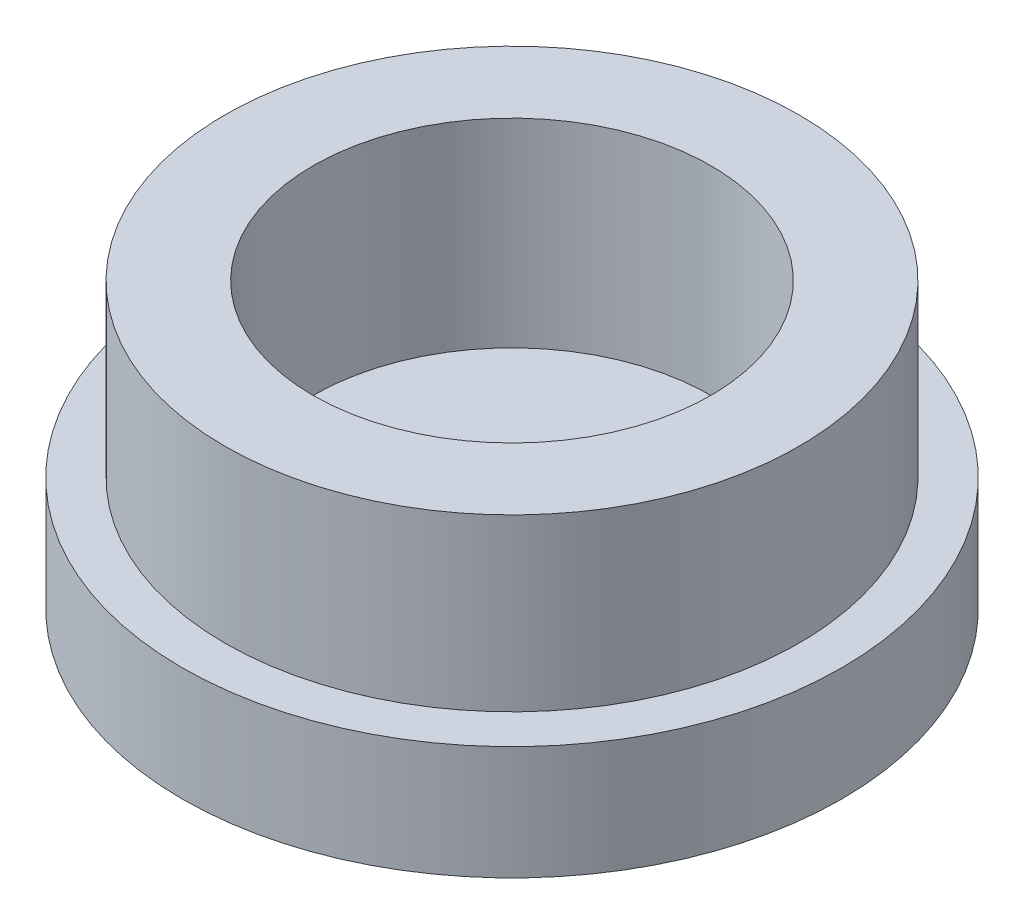
ISO-10303-21;
HEADER;
FILE_DESCRIPTION(('STEP AP214'),'2;1');
FILE_NAME('part.step','',(''),(''),'','','');
FILE_SCHEMA(('AUTOMOTIVE_DESIGN { 1 0 10303 214 1 1 1 1 }'));
ENDSEC;
DATA;
#1=APPLICATION_CONTEXT('core data for automotive mechanical design processes');
#2=APPLICATION_PROTOCOL_DEFINITION('international standard','automotive_design',2000,#1);
#3=PRODUCT_CONTEXT('',#1,'mechanical');
#4=PRODUCT('Part','Part','',(#3));
#5=PRODUCT_RELATED_PRODUCT_CATEGORY('part','',(#4));
#6=PRODUCT_DEFINITION_FORMATION('','',#4);
#7=PRODUCT_DEFINITION_CONTEXT('part definition',#1,'design');
#8=PRODUCT_DEFINITION('design','',#6,#7);
#9=PRODUCT_DEFINITION_SHAPE('','',#8);
#10=(LENGTH_UNIT() NAMED_UNIT(*) SI_UNIT(.MILLI.,.METRE.));
#11=(NAMED_UNIT(*) PLANE_ANGLE_UNIT() SI_UNIT($,.RADIAN.));
#12=(NAMED_UNIT(*) SI_UNIT($,.STERADIAN.) SOLID_ANGLE_UNIT());
#13=UNCERTAINTY_MEASURE_WITH_UNIT(LENGTH_MEASURE(1.E-05),#10,'distance_accuracy_value','');
#14=(GEOMETRIC_REPRESENTATION_CONTEXT(3) GLOBAL_UNCERTAINTY_ASSIGNED_CONTEXT((#13)) GLOBAL_UNIT_ASSIGNED_CONTEXT((#10,
#11,#12)) REPRESENTATION_CONTEXT('',''));
#15=CARTESIAN_POINT('',(0.,0.,0.));
#16=DIRECTION('',(0.,0.,1.));
#17=DIRECTION('',(1.,0.,0.));
#18=AXIS2_PLACEMENT_3D('',#15,#16,#17);
#19=CARTESIAN_POINT('',(0.,5.,0.));
#20=DIRECTION('',(0.,1.,0.));
#21=DIRECTION('',(0.,0.,1.));
#22=AXIS2_PLACEMENT_3D('',#19,#20,#21);
#23=PLANE('',#22);
#24=CARTESIAN_POINT('',(0.,5.,0.));
#25=DIRECTION('',(0.,1.,0.));
#26=DIRECTION('',(0.,0.,1.));
#27=AXIS2_PLACEMENT_3D('',#24,#25,#26);
#28=CIRCLE('',#27,3.5);
#29=CARTESIAN_POINT('',(0.,5.,3.5));
#30=VERTEX_POINT('',#29);
#31=EDGE_CURVE('E43',#30,#30,#28,.T.);
#32=ORIENTED_EDGE('',*,*,#31,.F.);
#33=EDGE_LOOP('',(#32));
#34=FACE_BOUND('',#33,.T.);
#35=CARTESIAN_POINT('',(0.,5.,0.));
#36=DIRECTION('',(0.,1.,0.));
#37=DIRECTION('',(0.,0.,1.));
#38=AXIS2_PLACEMENT_3D('',#35,#36,#37);
#39=CIRCLE('',#38,5.05);
#40=CARTESIAN_POINT('',(0.,5.,5.05));
#41=VERTEX_POINT('',#40);
#42=EDGE_CURVE('E48',#41,#41,#39,.T.);
#43=ORIENTED_EDGE('',*,*,#42,.T.);
#44=EDGE_LOOP('',(#43));
#45=FACE_BOUND('',#44,.T.);
#46=ADVANCED_FACE('F31',(#34,#45),#23,.T.);
#47=CARTESIAN_POINT('',(0.,1.5,0.));
#48=DIRECTION('',(0.,1.,0.));
#49=DIRECTION('',(0.,0.,1.));
#50=AXIS2_PLACEMENT_3D('',#47,#48,#49);
#51=CYLINDRICAL_SURFACE('',#50,3.5);
#52=CARTESIAN_POINT('',(0.,1.5,0.));
#53=DIRECTION('',(0.,1.,0.));
#54=DIRECTION('',(0.,0.,1.));
#55=AXIS2_PLACEMENT_3D('',#52,#53,#54);
#56=CIRCLE('',#55,3.5);
#57=CARTESIAN_POINT('',(0.,1.5,3.5));
#58=VERTEX_POINT('',#57);
#59=EDGE_CURVE('E39',#58,#58,#56,.T.);
#60=ORIENTED_EDGE('',*,*,#59,.F.);
#61=EDGE_LOOP('',(#60));
#62=FACE_BOUND('',#61,.T.);
#63=ORIENTED_EDGE('',*,*,#31,.T.);
#64=EDGE_LOOP('',(#63));
#65=FACE_BOUND('',#64,.T.);
#66=ADVANCED_FACE('F68',(#62,#65),#51,.F.);
#67=CARTESIAN_POINT('',(0.,1.5,0.));
#68=DIRECTION('',(0.,1.,0.));
#69=DIRECTION('',(0.,0.,1.));
#70=AXIS2_PLACEMENT_3D('',#67,#68,#69);
#71=PLANE('',#70);
#72=ORIENTED_EDGE('',*,*,#59,.T.);
#73=EDGE_LOOP('',(#72));
#74=FACE_BOUND('',#73,.T.);
#75=ADVANCED_FACE('F74',(#74),#71,.T.);
#76=CARTESIAN_POINT('',(0.,2.,0.));
#77=DIRECTION('',(0.,1.,0.));
#78=DIRECTION('',(0.,0.,1.));
#79=AXIS2_PLACEMENT_3D('',#76,#77,#78);
#80=PLANE('',#79);
#81=CARTESIAN_POINT('',(0.,2.,0.));
#82=DIRECTION('',(0.,1.,0.));
#83=DIRECTION('',(0.,0.,1.));
#84=AXIS2_PLACEMENT_3D('',#81,#82,#83);
#85=CIRCLE('',#84,5.05);
#86=CARTESIAN_POINT('',(0.,2.,5.05));
#87=VERTEX_POINT('',#86);
#88=EDGE_CURVE('E51',#87,#87,#85,.T.);
#89=ORIENTED_EDGE('',*,*,#88,.F.);
#90=EDGE_LOOP('',(#89));
#91=FACE_BOUND('',#90,.T.);
#92=CARTESIAN_POINT('',(0.,2.,0.));
#93=DIRECTION('',(0.,1.,0.));
#94=DIRECTION('',(0.,0.,1.));
#95=AXIS2_PLACEMENT_3D('',#92,#93,#94);
#96=CIRCLE('',#95,5.8);
#97=CARTESIAN_POINT('',(0.,2.,5.8));
#98=VERTEX_POINT('',#97);
#99=EDGE_CURVE('E35',#98,#98,#96,.T.);
#100=ORIENTED_EDGE('',*,*,#99,.T.);
#101=EDGE_LOOP('',(#100));
#102=FACE_BOUND('',#101,.T.);
#103=ADVANCED_FACE('F58',(#91,#102),#80,.T.);
#104=CARTESIAN_POINT('',(0.,2.,0.));
#105=DIRECTION('',(0.,1.,0.));
#106=DIRECTION('',(0.,0.,1.));
#107=AXIS2_PLACEMENT_3D('',#104,#105,#106);
#108=CYLINDRICAL_SURFACE('',#107,5.05);
#109=ORIENTED_EDGE('',*,*,#88,.T.);
#110=EDGE_LOOP('',(#109));
#111=FACE_BOUND('',#110,.T.);
#112=ORIENTED_EDGE('',*,*,#42,.F.);
#113=EDGE_LOOP('',(#112));
#114=FACE_BOUND('',#113,.T.);
#115=ADVANCED_FACE('F65',(#111,#114),#108,.T.);
#116=CARTESIAN_POINT('',(0.,0.,0.));
#117=DIRECTION('',(0.,1.,0.));
#118=DIRECTION('',(0.,0.,1.));
#119=AXIS2_PLACEMENT_3D('',#116,#117,#118);
#120=PLANE('',#119);
#121=CARTESIAN_POINT('',(0.,0.,0.));
#122=DIRECTION('',(0.,1.,0.));
#123=DIRECTION('',(0.,0.,1.));
#124=AXIS2_PLACEMENT_3D('',#121,#122,#123);
#125=CIRCLE('',#124,5.8);
#126=CARTESIAN_POINT('',(0.,0.,5.8));
#127=VERTEX_POINT('',#126);
#128=EDGE_CURVE('E10',#127,#127,#125,.T.);
#129=ORIENTED_EDGE('',*,*,#128,.F.);
#130=EDGE_LOOP('',(#129));
#131=FACE_BOUND('',#130,.T.);
#132=ADVANCED_FACE('F61',(#131),#120,.F.);
#133=CARTESIAN_POINT('',(0.,5.,0.));
#134=DIRECTION('',(0.,-1.,0.));
#135=DIRECTION('',(0.,0.,-1.));
#136=AXIS2_PLACEMENT_3D('',#133,#134,#135);
#137=CYLINDRICAL_SURFACE('',#136,5.8);
#138=ORIENTED_EDGE('',*,*,#128,.T.);
#139=EDGE_LOOP('',(#138));
#140=FACE_BOUND('',#139,.T.);
#141=ORIENTED_EDGE('',*,*,#99,.F.);
#142=EDGE_LOOP('',(#141));
#143=FACE_BOUND('',#142,.T.);
#144=ADVANCED_FACE('F33',(#140,#143),#137,.T.);
#145=CLOSED_SHELL('',(#46,#66,#75,#103,#115,#132,#144));
#146=MANIFOLD_SOLID_BREP('B2',#145);
#147=ADVANCED_BREP_SHAPE_REPRESENTATION('',(#18,#146),#14);
#148=SHAPE_DEFINITION_REPRESENTATION(#9,#147);
ENDSEC;
END-ISO-10303-21;
